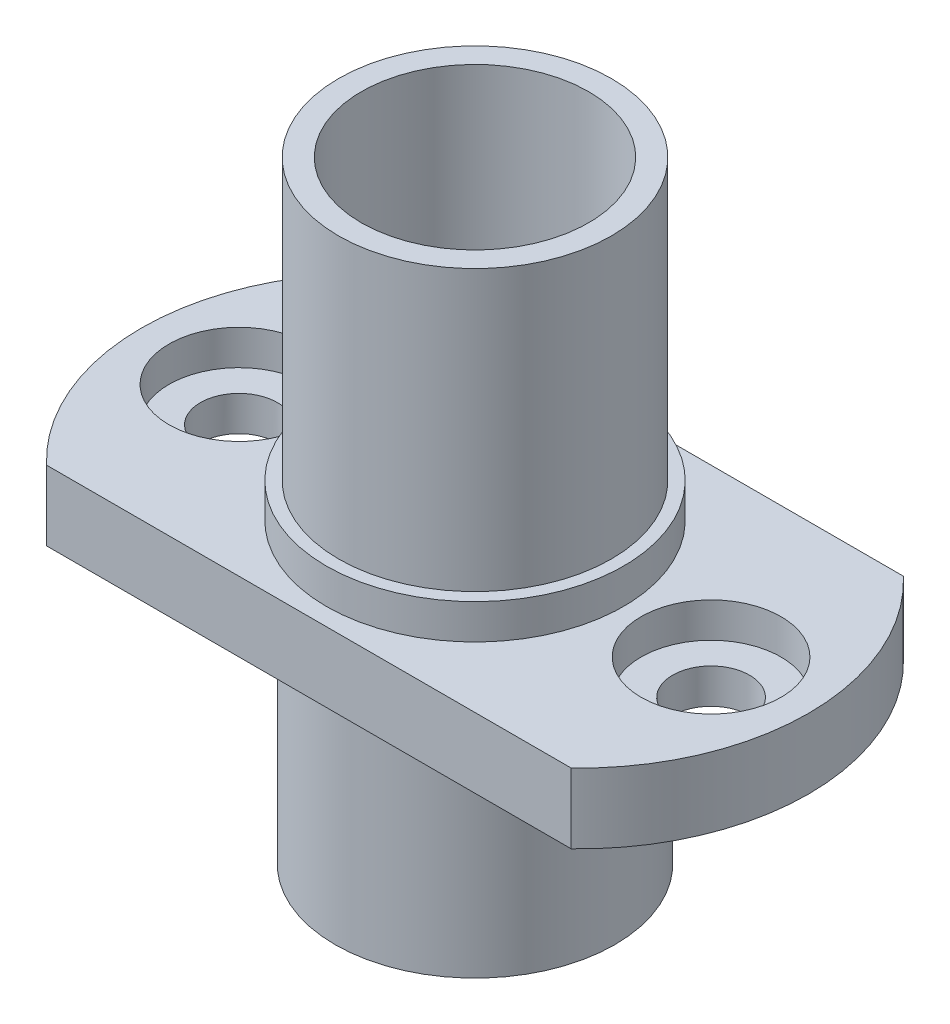
ISO-10303-21;
HEADER;
FILE_DESCRIPTION(('STEP AP214'),'2;1');
FILE_NAME('part.step','',(''),(''),'','','');
FILE_SCHEMA(('AUTOMOTIVE_DESIGN { 1 0 10303 214 1 1 1 1 }'));
ENDSEC;
DATA;
#1=APPLICATION_CONTEXT('core data for automotive mechanical design processes');
#2=APPLICATION_PROTOCOL_DEFINITION('international standard','automotive_design',2000,#1);
#3=PRODUCT_CONTEXT('',#1,'mechanical');
#4=PRODUCT('Part','Part','',(#3));
#5=PRODUCT_RELATED_PRODUCT_CATEGORY('part','',(#4));
#6=PRODUCT_DEFINITION_FORMATION('','',#4);
#7=PRODUCT_DEFINITION_CONTEXT('part definition',#1,'design');
#8=PRODUCT_DEFINITION('design','',#6,#7);
#9=PRODUCT_DEFINITION_SHAPE('','',#8);
#10=(LENGTH_UNIT() NAMED_UNIT(*) SI_UNIT(.MILLI.,.METRE.));
#11=(NAMED_UNIT(*) PLANE_ANGLE_UNIT() SI_UNIT($,.RADIAN.));
#12=(NAMED_UNIT(*) SI_UNIT($,.STERADIAN.) SOLID_ANGLE_UNIT());
#13=UNCERTAINTY_MEASURE_WITH_UNIT(LENGTH_MEASURE(1.E-05),#10,'distance_accuracy_value','');
#14=(GEOMETRIC_REPRESENTATION_CONTEXT(3) GLOBAL_UNCERTAINTY_ASSIGNED_CONTEXT((#13)) GLOBAL_UNIT_ASSIGNED_CONTEXT((#10,
#11,#12)) REPRESENTATION_CONTEXT('',''));
#15=CARTESIAN_POINT('',(0.,0.,0.));
#16=DIRECTION('',(0.,0.,1.));
#17=DIRECTION('',(1.,0.,0.));
#18=AXIS2_PLACEMENT_3D('',#15,#16,#17);
#19=CARTESIAN_POINT('',(-2.99001108648813,-1.,0.));
#20=DIRECTION('',(0.,-1.,0.));
#21=DIRECTION('',(0.,0.,-1.));
#22=AXIS2_PLACEMENT_3D('',#19,#20,#21);
#23=PLANE('',#22);
#24=CARTESIAN_POINT('',(-2.99001108648813,-1.,0.));
#25=DIRECTION('',(0.,1.,0.));
#26=DIRECTION('',(0.,0.,-1.));
#27=AXIS2_PLACEMENT_3D('',#24,#25,#26);
#28=CIRCLE('',#27,6.55);
#29=CARTESIAN_POINT('',(-7.5,-1.,-4.75));
#30=VERTEX_POINT('',#29);
#31=CARTESIAN_POINT('',(-7.5,-1.,4.75));
#32=VERTEX_POINT('',#31);
#33=EDGE_CURVE('E97',#30,#32,#28,.T.);
#34=ORIENTED_EDGE('',*,*,#33,.F.);
#35=DIRECTION('',(-1.,0.,0.));
#36=VECTOR('',#35,1.);
#37=CARTESIAN_POINT('',(-7.5,-1.,-4.75));
#38=LINE('',#37,#36);
#39=CARTESIAN_POINT('',(7.5,-1.,-4.75));
#40=VERTEX_POINT('',#39);
#41=EDGE_CURVE('E111',#40,#30,#38,.T.);
#42=ORIENTED_EDGE('',*,*,#41,.F.);
#43=CARTESIAN_POINT('',(2.99001108648813,-1.,0.));
#44=DIRECTION('',(0.,1.,0.));
#45=DIRECTION('',(0.,0.,1.));
#46=AXIS2_PLACEMENT_3D('',#43,#44,#45);
#47=CIRCLE('',#46,6.55);
#48=CARTESIAN_POINT('',(7.50000000000001,-1.,4.75));
#49=VERTEX_POINT('',#48);
#50=EDGE_CURVE('E100',#49,#40,#47,.T.);
#51=ORIENTED_EDGE('',*,*,#50,.F.);
#52=DIRECTION('',(1.,0.,0.));
#53=VECTOR('',#52,1.);
#54=CARTESIAN_POINT('',(-7.5,-1.,4.75));
#55=LINE('',#54,#53);
#56=EDGE_CURVE('E85',#32,#49,#55,.T.);
#57=ORIENTED_EDGE('',*,*,#56,.F.);
#58=EDGE_LOOP('',(#34,#42,#51,#57));
#59=FACE_BOUND('',#58,.T.);
#60=CARTESIAN_POINT('',(6.75,-1.,0.));
#61=DIRECTION('',(0.,1.,0.));
#62=DIRECTION('',(0.,0.,1.));
#63=AXIS2_PLACEMENT_3D('',#60,#61,#62);
#64=CIRCLE('',#63,1.1);
#65=CARTESIAN_POINT('',(6.75,-1.,1.1));
#66=VERTEX_POINT('',#65);
#67=EDGE_CURVE('E150',#66,#66,#64,.T.);
#68=ORIENTED_EDGE('',*,*,#67,.T.);
#69=EDGE_LOOP('',(#68));
#70=FACE_BOUND('',#69,.T.);
#71=CARTESIAN_POINT('',(-6.75,-1.,0.));
#72=DIRECTION('',(0.,1.,0.));
#73=DIRECTION('',(0.,0.,-1.));
#74=AXIS2_PLACEMENT_3D('',#71,#72,#73);
#75=CIRCLE('',#74,1.1);
#76=CARTESIAN_POINT('',(-6.75,-1.,-1.1));
#77=VERTEX_POINT('',#76);
#78=EDGE_CURVE('E124',#77,#77,#75,.T.);
#79=ORIENTED_EDGE('',*,*,#78,.T.);
#80=EDGE_LOOP('',(#79));
#81=FACE_BOUND('',#80,.T.);
#82=CARTESIAN_POINT('',(0.,-1.,0.));
#83=DIRECTION('',(0.,-1.,0.));
#84=DIRECTION('',(0.,0.,-1.));
#85=AXIS2_PLACEMENT_3D('',#82,#83,#84);
#86=CIRCLE('',#85,4.);
#87=CARTESIAN_POINT('',(0.,-1.,4.));
#88=VERTEX_POINT('',#87);
#89=EDGE_CURVE('E143',#88,#88,#86,.T.);
#90=ORIENTED_EDGE('',*,*,#89,.F.);
#91=EDGE_LOOP('',(#90));
#92=FACE_BOUND('',#91,.T.);
#93=ADVANCED_FACE('F39',(#59,#70,#81,#92),#23,.T.);
#94=CARTESIAN_POINT('',(-6.75,-1.,0.));
#95=DIRECTION('',(0.,1.,0.));
#96=DIRECTION('',(0.,0.,1.));
#97=AXIS2_PLACEMENT_3D('',#94,#95,#96);
#98=CYLINDRICAL_SURFACE('',#97,1.1);
#99=ORIENTED_EDGE('',*,*,#78,.F.);
#100=EDGE_LOOP('',(#99));
#101=FACE_BOUND('',#100,.T.);
#102=CARTESIAN_POINT('',(-6.75,0.,0.));
#103=DIRECTION('',(0.,1.,0.));
#104=DIRECTION('',(0.,0.,1.));
#105=AXIS2_PLACEMENT_3D('',#102,#103,#104);
#106=CIRCLE('',#105,1.1);
#107=CARTESIAN_POINT('',(-6.75,0.,1.1));
#108=VERTEX_POINT('',#107);
#109=EDGE_CURVE('E126',#108,#108,#106,.F.);
#110=ORIENTED_EDGE('',*,*,#109,.F.);
#111=EDGE_LOOP('',(#110));
#112=FACE_BOUND('',#111,.T.);
#113=ADVANCED_FACE('F174',(#101,#112),#98,.F.);
#114=CARTESIAN_POINT('',(6.75,-1.,0.));
#115=DIRECTION('',(0.,1.,0.));
#116=DIRECTION('',(0.,0.,1.));
#117=AXIS2_PLACEMENT_3D('',#114,#115,#116);
#118=CYLINDRICAL_SURFACE('',#117,1.1);
#119=ORIENTED_EDGE('',*,*,#67,.F.);
#120=EDGE_LOOP('',(#119));
#121=FACE_BOUND('',#120,.T.);
#122=CARTESIAN_POINT('',(6.75,0.,0.));
#123=DIRECTION('',(0.,1.,0.));
#124=DIRECTION('',(0.,0.,1.));
#125=AXIS2_PLACEMENT_3D('',#122,#123,#124);
#126=CIRCLE('',#125,1.1);
#127=CARTESIAN_POINT('',(6.75,0.,1.1));
#128=VERTEX_POINT('',#127);
#129=EDGE_CURVE('E122',#128,#128,#126,.F.);
#130=ORIENTED_EDGE('',*,*,#129,.F.);
#131=EDGE_LOOP('',(#130));
#132=FACE_BOUND('',#131,.T.);
#133=ADVANCED_FACE('F179',(#121,#132),#118,.F.);
#134=CARTESIAN_POINT('',(-2.99001108648813,1.,0.));
#135=DIRECTION('',(0.,-1.,0.));
#136=DIRECTION('',(0.,0.,-1.));
#137=AXIS2_PLACEMENT_3D('',#134,#135,#136);
#138=PLANE('',#137);
#139=CARTESIAN_POINT('',(-6.75,1.,0.));
#140=DIRECTION('',(0.,1.,0.));
#141=DIRECTION('',(0.,0.,1.));
#142=AXIS2_PLACEMENT_3D('',#139,#140,#141);
#143=CIRCLE('',#142,2.);
#144=CARTESIAN_POINT('',(-6.75,1.,2.));
#145=VERTEX_POINT('',#144);
#146=EDGE_CURVE('E135',#145,#145,#143,.T.);
#147=ORIENTED_EDGE('',*,*,#146,.F.);
#148=EDGE_LOOP('',(#147));
#149=FACE_BOUND('',#148,.T.);
#150=CARTESIAN_POINT('',(6.75,1.,0.));
#151=DIRECTION('',(0.,1.,0.));
#152=DIRECTION('',(0.,0.,1.));
#153=AXIS2_PLACEMENT_3D('',#150,#151,#152);
#154=CIRCLE('',#153,2.);
#155=CARTESIAN_POINT('',(6.75,1.,2.));
#156=VERTEX_POINT('',#155);
#157=EDGE_CURVE('E128',#156,#156,#154,.T.);
#158=ORIENTED_EDGE('',*,*,#157,.F.);
#159=EDGE_LOOP('',(#158));
#160=FACE_BOUND('',#159,.T.);
#161=CARTESIAN_POINT('',(-2.99001108648813,1.,0.));
#162=DIRECTION('',(0.,1.,0.));
#163=DIRECTION('',(0.,0.,-1.));
#164=AXIS2_PLACEMENT_3D('',#161,#162,#163);
#165=CIRCLE('',#164,6.55);
#166=CARTESIAN_POINT('',(-7.5,1.,-4.75));
#167=VERTEX_POINT('',#166);
#168=CARTESIAN_POINT('',(-7.5,1.,4.75));
#169=VERTEX_POINT('',#168);
#170=EDGE_CURVE('E113',#167,#169,#165,.T.);
#171=ORIENTED_EDGE('',*,*,#170,.T.);
#172=DIRECTION('',(1.,0.,0.));
#173=VECTOR('',#172,1.);
#174=CARTESIAN_POINT('',(-7.5,1.,4.75));
#175=LINE('',#174,#173);
#176=CARTESIAN_POINT('',(7.50000000000001,1.,4.75));
#177=VERTEX_POINT('',#176);
#178=EDGE_CURVE('E86',#169,#177,#175,.T.);
#179=ORIENTED_EDGE('',*,*,#178,.T.);
#180=CARTESIAN_POINT('',(2.99001108648813,1.,0.));
#181=DIRECTION('',(0.,1.,0.));
#182=DIRECTION('',(0.,0.,1.));
#183=AXIS2_PLACEMENT_3D('',#180,#181,#182);
#184=CIRCLE('',#183,6.55);
#185=CARTESIAN_POINT('',(7.5,1.,-4.75));
#186=VERTEX_POINT('',#185);
#187=EDGE_CURVE('E61',#177,#186,#184,.T.);
#188=ORIENTED_EDGE('',*,*,#187,.T.);
#189=DIRECTION('',(-1.,0.,0.));
#190=VECTOR('',#189,1.);
#191=CARTESIAN_POINT('',(-7.5,1.,-4.75));
#192=LINE('',#191,#190);
#193=EDGE_CURVE('E56',#186,#167,#192,.T.);
#194=ORIENTED_EDGE('',*,*,#193,.T.);
#195=EDGE_LOOP('',(#171,#179,#188,#194));
#196=FACE_BOUND('',#195,.T.);
#197=CARTESIAN_POINT('',(0.,1.,0.));
#198=DIRECTION('',(0.,-1.,0.));
#199=DIRECTION('',(0.,0.,-1.));
#200=AXIS2_PLACEMENT_3D('',#197,#198,#199);
#201=CIRCLE('',#200,4.25);
#202=CARTESIAN_POINT('',(0.,1.,-4.25));
#203=VERTEX_POINT('',#202);
#204=EDGE_CURVE('E13',#203,#203,#201,.F.);
#205=ORIENTED_EDGE('',*,*,#204,.F.);
#206=EDGE_LOOP('',(#205));
#207=FACE_BOUND('',#206,.T.);
#208=ADVANCED_FACE('F171',(#149,#160,#196,#207),#138,.F.);
#209=CARTESIAN_POINT('',(-2.99001108648813,1.,0.));
#210=DIRECTION('',(0.,-1.,0.));
#211=DIRECTION('',(0.,0.,-1.));
#212=AXIS2_PLACEMENT_3D('',#209,#210,#211);
#213=CYLINDRICAL_SURFACE('',#212,6.55);
#214=DIRECTION('',(0.,-1.,0.));
#215=VECTOR('',#214,1.);
#216=CARTESIAN_POINT('',(-7.5,1.,-4.75));
#217=LINE('',#216,#215);
#218=EDGE_CURVE('E102',#167,#30,#217,.T.);
#219=ORIENTED_EDGE('',*,*,#218,.T.);
#220=ORIENTED_EDGE('',*,*,#33,.T.);
#221=DIRECTION('',(0.,-1.,0.));
#222=VECTOR('',#221,1.);
#223=CARTESIAN_POINT('',(-7.5,1.,4.75));
#224=LINE('',#223,#222);
#225=EDGE_CURVE('E48',#169,#32,#224,.T.);
#226=ORIENTED_EDGE('',*,*,#225,.F.);
#227=ORIENTED_EDGE('',*,*,#170,.F.);
#228=EDGE_LOOP('',(#219,#220,#226,#227));
#229=FACE_BOUND('',#228,.T.);
#230=ADVANCED_FACE('F41',(#229),#213,.T.);
#231=CARTESIAN_POINT('',(-7.5,1.,4.75));
#232=DIRECTION('',(0.,0.,-1.));
#233=DIRECTION('',(-1.,0.,0.));
#234=AXIS2_PLACEMENT_3D('',#231,#232,#233);
#235=PLANE('',#234);
#236=ORIENTED_EDGE('',*,*,#225,.T.);
#237=ORIENTED_EDGE('',*,*,#56,.T.);
#238=DIRECTION('',(0.,-1.,0.));
#239=VECTOR('',#238,1.);
#240=CARTESIAN_POINT('',(7.50000000000001,1.,4.75));
#241=LINE('',#240,#239);
#242=EDGE_CURVE('E90',#177,#49,#241,.T.);
#243=ORIENTED_EDGE('',*,*,#242,.F.);
#244=ORIENTED_EDGE('',*,*,#178,.F.);
#245=EDGE_LOOP('',(#236,#237,#243,#244));
#246=FACE_BOUND('',#245,.T.);
#247=ADVANCED_FACE('F83',(#246),#235,.F.);
#248=CARTESIAN_POINT('',(2.99001108648813,1.,0.));
#249=DIRECTION('',(0.,-1.,0.));
#250=DIRECTION('',(0.,0.,-1.));
#251=AXIS2_PLACEMENT_3D('',#248,#249,#250);
#252=CYLINDRICAL_SURFACE('',#251,6.55);
#253=ORIENTED_EDGE('',*,*,#242,.T.);
#254=ORIENTED_EDGE('',*,*,#50,.T.);
#255=DIRECTION('',(0.,-1.,0.));
#256=VECTOR('',#255,1.);
#257=CARTESIAN_POINT('',(7.5,1.,-4.75));
#258=LINE('',#257,#256);
#259=EDGE_CURVE('E119',#186,#40,#258,.T.);
#260=ORIENTED_EDGE('',*,*,#259,.F.);
#261=ORIENTED_EDGE('',*,*,#187,.F.);
#262=EDGE_LOOP('',(#253,#254,#260,#261));
#263=FACE_BOUND('',#262,.T.);
#264=ADVANCED_FACE('F188',(#263),#252,.T.);
#265=CARTESIAN_POINT('',(-7.5,1.,-4.75));
#266=DIRECTION('',(0.,0.,1.));
#267=DIRECTION('',(1.,0.,0.));
#268=AXIS2_PLACEMENT_3D('',#265,#266,#267);
#269=PLANE('',#268);
#270=ORIENTED_EDGE('',*,*,#259,.T.);
#271=ORIENTED_EDGE('',*,*,#41,.T.);
#272=ORIENTED_EDGE('',*,*,#218,.F.);
#273=ORIENTED_EDGE('',*,*,#193,.F.);
#274=EDGE_LOOP('',(#270,#271,#272,#273));
#275=FACE_BOUND('',#274,.T.);
#276=ADVANCED_FACE('F185',(#275),#269,.F.);
#277=CARTESIAN_POINT('',(0.,10.,0.));
#278=DIRECTION('',(0.,-1.,0.));
#279=DIRECTION('',(0.,0.,-1.));
#280=AXIS2_PLACEMENT_3D('',#277,#278,#279);
#281=CYLINDRICAL_SURFACE('',#280,4.25);
#282=CARTESIAN_POINT('',(0.,2.,0.));
#283=DIRECTION('',(0.,-1.,0.));
#284=DIRECTION('',(0.,0.,-1.));
#285=AXIS2_PLACEMENT_3D('',#282,#283,#284);
#286=CIRCLE('',#285,4.25);
#287=CARTESIAN_POINT('',(0.,2.,-4.25));
#288=VERTEX_POINT('',#287);
#289=EDGE_CURVE('E43',#288,#288,#286,.T.);
#290=ORIENTED_EDGE('',*,*,#289,.T.);
#291=EDGE_LOOP('',(#290));
#292=FACE_BOUND('',#291,.T.);
#293=ORIENTED_EDGE('',*,*,#204,.T.);
#294=EDGE_LOOP('',(#293));
#295=FACE_BOUND('',#294,.T.);
#296=ADVANCED_FACE('F183',(#292,#295),#281,.T.);
#297=CARTESIAN_POINT('',(6.75,0.,0.));
#298=DIRECTION('',(0.,1.,0.));
#299=DIRECTION('',(0.,0.,1.));
#300=AXIS2_PLACEMENT_3D('',#297,#298,#299);
#301=PLANE('',#300);
#302=CARTESIAN_POINT('',(6.75,0.,0.));
#303=DIRECTION('',(0.,1.,0.));
#304=DIRECTION('',(0.,0.,1.));
#305=AXIS2_PLACEMENT_3D('',#302,#303,#304);
#306=CIRCLE('',#305,2.);
#307=CARTESIAN_POINT('',(6.75,0.,2.));
#308=VERTEX_POINT('',#307);
#309=EDGE_CURVE('E125',#308,#308,#306,.T.);
#310=ORIENTED_EDGE('',*,*,#309,.T.);
#311=EDGE_LOOP('',(#310));
#312=FACE_BOUND('',#311,.T.);
#313=ORIENTED_EDGE('',*,*,#129,.T.);
#314=EDGE_LOOP('',(#313));
#315=FACE_BOUND('',#314,.T.);
#316=ADVANCED_FACE('F211',(#312,#315),#301,.T.);
#317=CARTESIAN_POINT('',(6.75,0.,0.));
#318=DIRECTION('',(0.,1.,0.));
#319=DIRECTION('',(0.,0.,1.));
#320=AXIS2_PLACEMENT_3D('',#317,#318,#319);
#321=CYLINDRICAL_SURFACE('',#320,2.);
#322=ORIENTED_EDGE('',*,*,#309,.F.);
#323=EDGE_LOOP('',(#322));
#324=FACE_BOUND('',#323,.T.);
#325=ORIENTED_EDGE('',*,*,#157,.T.);
#326=EDGE_LOOP('',(#325));
#327=FACE_BOUND('',#326,.T.);
#328=ADVANCED_FACE('F216',(#324,#327),#321,.F.);
#329=CARTESIAN_POINT('',(-6.75,0.,0.));
#330=DIRECTION('',(0.,1.,0.));
#331=DIRECTION('',(0.,0.,1.));
#332=AXIS2_PLACEMENT_3D('',#329,#330,#331);
#333=PLANE('',#332);
#334=CARTESIAN_POINT('',(-6.75,0.,0.));
#335=DIRECTION('',(0.,1.,0.));
#336=DIRECTION('',(0.,0.,1.));
#337=AXIS2_PLACEMENT_3D('',#334,#335,#336);
#338=CIRCLE('',#337,2.);
#339=CARTESIAN_POINT('',(-6.75,0.,2.));
#340=VERTEX_POINT('',#339);
#341=EDGE_CURVE('E129',#340,#340,#338,.T.);
#342=ORIENTED_EDGE('',*,*,#341,.T.);
#343=EDGE_LOOP('',(#342));
#344=FACE_BOUND('',#343,.T.);
#345=ORIENTED_EDGE('',*,*,#109,.T.);
#346=EDGE_LOOP('',(#345));
#347=FACE_BOUND('',#346,.T.);
#348=ADVANCED_FACE('F249',(#344,#347),#333,.T.);
#349=CARTESIAN_POINT('',(-6.75,0.,0.));
#350=DIRECTION('',(0.,1.,0.));
#351=DIRECTION('',(0.,0.,1.));
#352=AXIS2_PLACEMENT_3D('',#349,#350,#351);
#353=CYLINDRICAL_SURFACE('',#352,2.);
#354=ORIENTED_EDGE('',*,*,#341,.F.);
#355=EDGE_LOOP('',(#354));
#356=FACE_BOUND('',#355,.T.);
#357=ORIENTED_EDGE('',*,*,#146,.T.);
#358=EDGE_LOOP('',(#357));
#359=FACE_BOUND('',#358,.T.);
#360=ADVANCED_FACE('F239',(#356,#359),#353,.F.);
#361=CARTESIAN_POINT('',(0.,-7.5,0.));
#362=DIRECTION('',(0.,1.,0.));
#363=DIRECTION('',(0.,0.,1.));
#364=AXIS2_PLACEMENT_3D('',#361,#362,#363);
#365=CYLINDRICAL_SURFACE('',#364,4.);
#366=CARTESIAN_POINT('',(0.,-7.5,0.));
#367=DIRECTION('',(0.,-1.,0.));
#368=DIRECTION('',(0.,0.,-1.));
#369=AXIS2_PLACEMENT_3D('',#366,#367,#368);
#370=CIRCLE('',#369,4.);
#371=CARTESIAN_POINT('',(0.,-7.5,4.));
#372=VERTEX_POINT('',#371);
#373=EDGE_CURVE('E140',#372,#372,#370,.T.);
#374=CARTESIAN_POINT('',(0.,-7.5,4.));
#375=CARTESIAN_POINT('',(0.,-7.43229166666667,4.));
#376=CARTESIAN_POINT('',(0.,-7.36458333333333,4.));
#377=CARTESIAN_POINT('',(0.,-7.22916666666667,4.));
#378=CARTESIAN_POINT('',(0.,-7.16145833333333,4.));
#379=CARTESIAN_POINT('',(0.,-7.02604166666667,4.));
#380=CARTESIAN_POINT('',(0.,-6.95833333333333,4.));
#381=CARTESIAN_POINT('',(0.,-6.82291666666667,4.));
#382=CARTESIAN_POINT('',(0.,-6.75520833333333,4.));
#383=CARTESIAN_POINT('',(0.,-6.61979166666667,4.));
#384=CARTESIAN_POINT('',(0.,-6.55208333333333,4.));
#385=CARTESIAN_POINT('',(0.,-6.41666666666667,4.));
#386=CARTESIAN_POINT('',(0.,-6.34895833333333,4.));
#387=CARTESIAN_POINT('',(0.,-6.21354166666667,4.));
#388=CARTESIAN_POINT('',(0.,-6.14583333333333,4.));
#389=CARTESIAN_POINT('',(0.,-6.01041666666667,4.));
#390=CARTESIAN_POINT('',(0.,-5.94270833333333,4.));
#391=CARTESIAN_POINT('',(0.,-5.80729166666667,4.));
#392=CARTESIAN_POINT('',(0.,-5.73958333333333,4.));
#393=CARTESIAN_POINT('',(0.,-5.60416666666667,4.));
#394=CARTESIAN_POINT('',(0.,-5.53645833333333,4.));
#395=CARTESIAN_POINT('',(0.,-5.40104166666667,4.));
#396=CARTESIAN_POINT('',(0.,-5.33333333333333,4.));
#397=CARTESIAN_POINT('',(0.,-5.19791666666667,4.));
#398=CARTESIAN_POINT('',(0.,-5.13020833333333,4.));
#399=CARTESIAN_POINT('',(0.,-4.99479166666667,4.));
#400=CARTESIAN_POINT('',(0.,-4.92708333333333,4.));
#401=CARTESIAN_POINT('',(0.,-4.79166666666667,4.));
#402=CARTESIAN_POINT('',(0.,-4.72395833333333,4.));
#403=CARTESIAN_POINT('',(0.,-4.58854166666667,4.));
#404=CARTESIAN_POINT('',(0.,-4.52083333333333,4.));
#405=CARTESIAN_POINT('',(0.,-4.38541666666667,4.));
#406=CARTESIAN_POINT('',(0.,-4.31770833333333,4.));
#407=CARTESIAN_POINT('',(0.,-4.18229166666667,4.));
#408=CARTESIAN_POINT('',(0.,-4.11458333333333,4.));
#409=CARTESIAN_POINT('',(0.,-3.97916666666667,4.));
#410=CARTESIAN_POINT('',(0.,-3.91145833333333,4.));
#411=CARTESIAN_POINT('',(0.,-3.77604166666667,4.));
#412=CARTESIAN_POINT('',(0.,-3.70833333333333,4.));
#413=CARTESIAN_POINT('',(0.,-3.57291666666667,4.));
#414=CARTESIAN_POINT('',(0.,-3.50520833333333,4.));
#415=CARTESIAN_POINT('',(0.,-3.36979166666667,4.));
#416=CARTESIAN_POINT('',(0.,-3.30208333333333,4.));
#417=CARTESIAN_POINT('',(0.,-3.16666666666667,4.));
#418=CARTESIAN_POINT('',(0.,-3.09895833333333,4.));
#419=CARTESIAN_POINT('',(0.,-2.96354166666667,4.));
#420=CARTESIAN_POINT('',(0.,-2.89583333333333,4.));
#421=CARTESIAN_POINT('',(0.,-2.76041666666667,4.));
#422=CARTESIAN_POINT('',(0.,-2.69270833333333,4.));
#423=CARTESIAN_POINT('',(0.,-2.55729166666667,4.));
#424=CARTESIAN_POINT('',(0.,-2.48958333333333,4.));
#425=CARTESIAN_POINT('',(0.,-2.35416666666667,4.));
#426=CARTESIAN_POINT('',(0.,-2.28645833333333,4.));
#427=CARTESIAN_POINT('',(0.,-2.15104166666667,4.));
#428=CARTESIAN_POINT('',(0.,-2.08333333333333,4.));
#429=CARTESIAN_POINT('',(0.,-1.94791666666667,4.));
#430=CARTESIAN_POINT('',(0.,-1.88020833333333,4.));
#431=CARTESIAN_POINT('',(0.,-1.74479166666667,4.));
#432=CARTESIAN_POINT('',(0.,-1.67708333333333,4.));
#433=CARTESIAN_POINT('',(0.,-1.54166666666667,4.));
#434=CARTESIAN_POINT('',(0.,-1.47395833333333,4.));
#435=CARTESIAN_POINT('',(0.,-1.33854166666667,4.));
#436=CARTESIAN_POINT('',(0.,-1.27083333333333,4.));
#437=CARTESIAN_POINT('',(0.,-1.13541666666667,4.));
#438=CARTESIAN_POINT('',(0.,-1.06770833333333,4.));
#439=CARTESIAN_POINT('',(0.,-1.,4.));
#440=B_SPLINE_CURVE_WITH_KNOTS('',3,(#374,#375,#376,#377,#378,#379,#380,#381,#382,#383,#384,
#385,#386,#387,#388,#389,#390,#391,#392,#393,#394,#395,#396,#397,#398,#399,#400,#401,#402,#403,
#404,#405,#406,#407,#408,#409,#410,#411,#412,#413,#414,#415,#416,#417,#418,#419,#420,#421,#422,
#423,#424,#425,#426,#427,#428,#429,#430,#431,#432,#433,#434,#435,#436,#437,#438,#439),
.UNSPECIFIED.,.F.,.F.,(4,2,2,2,2,2,2,2,2,2,2,2,2,2,2,2,2,2,2,2,2,2,2,2,2,2,2,2,2,2,2,2,4),(0.,
0.203125,0.40625,0.609375000000001,0.812500000000001,1.015625,1.21875,1.421875,1.625,1.828125,
2.03125,2.234375,2.4375,2.640625,2.84375,3.046875,3.25,3.453125,3.65625,3.859375,4.0625,
4.265625,4.46875,4.671875,4.875,5.078125,5.28125,5.484375,5.6875,5.890625,6.09375,6.296875,6.5),.UNSPECIFIED.);
#441=EDGE_CURVE('BSEAM236',#372,#88,#440,.T.);
#442=ORIENTED_EDGE('',*,*,#373,.F.);
#443=ORIENTED_EDGE('',*,*,#89,.T.);
#444=ORIENTED_EDGE('',*,*,#441,.T.);
#445=ORIENTED_EDGE('',*,*,#441,.F.);
#446=EDGE_LOOP('',(#442,#444,#443,#445));
#447=FACE_BOUND('',#446,.T.);
#448=ADVANCED_FACE('F236',(#447),#365,.T.);
#449=CARTESIAN_POINT('',(0.,-7.5,0.));
#450=DIRECTION('',(0.,-1.,0.));
#451=DIRECTION('',(0.,0.,-1.));
#452=AXIS2_PLACEMENT_3D('',#449,#450,#451);
#453=PLANE('',#452);
#454=ORIENTED_EDGE('',*,*,#373,.T.);
#455=EDGE_LOOP('',(#454));
#456=FACE_BOUND('',#455,.T.);
#457=ADVANCED_FACE('F234',(#456),#453,.T.);
#458=CARTESIAN_POINT('',(-2.99001108648813,2.,0.));
#459=DIRECTION('',(0.,-1.,0.));
#460=DIRECTION('',(0.,0.,-1.));
#461=AXIS2_PLACEMENT_3D('',#458,#459,#460);
#462=PLANE('',#461);
#463=CARTESIAN_POINT('',(0.,2.,0.));
#464=DIRECTION('',(0.,-1.,0.));
#465=DIRECTION('',(0.,0.,-1.));
#466=AXIS2_PLACEMENT_3D('',#463,#464,#465);
#467=CIRCLE('',#466,3.9);
#468=CARTESIAN_POINT('',(0.,2.,3.9));
#469=VERTEX_POINT('',#468);
#470=EDGE_CURVE('E222',#469,#469,#467,.F.);
#471=ORIENTED_EDGE('',*,*,#470,.F.);
#472=EDGE_LOOP('',(#471));
#473=FACE_BOUND('',#472,.T.);
#474=ORIENTED_EDGE('',*,*,#289,.F.);
#475=EDGE_LOOP('',(#474));
#476=FACE_BOUND('',#475,.T.);
#477=ADVANCED_FACE('F247',(#473,#476),#462,.F.);
#478=CARTESIAN_POINT('',(0.,-20.5296213568261,0.));
#479=DIRECTION('',(0.,1.,0.));
#480=DIRECTION('',(0.,0.,1.));
#481=AXIS2_PLACEMENT_3D('',#478,#479,#480);
#482=CYLINDRICAL_SURFACE('',#481,3.9);
#483=CARTESIAN_POINT('',(0.,10.,0.));
#484=DIRECTION('',(0.,1.,0.));
#485=DIRECTION('',(0.,0.,1.));
#486=AXIS2_PLACEMENT_3D('',#483,#484,#485);
#487=CIRCLE('',#486,3.9);
#488=CARTESIAN_POINT('',(0.,9.99999999999999,3.9));
#489=VERTEX_POINT('',#488);
#490=EDGE_CURVE('E225',#489,#489,#487,.T.);
#491=CARTESIAN_POINT('',(0.,9.99999999999999,3.9));
#492=CARTESIAN_POINT('',(0.,9.91666666666666,3.9));
#493=CARTESIAN_POINT('',(0.,9.83333333333333,3.9));
#494=CARTESIAN_POINT('',(0.,9.66666666666666,3.9));
#495=CARTESIAN_POINT('',(0.,9.58333333333333,3.9));
#496=CARTESIAN_POINT('',(0.,9.41666666666666,3.9));
#497=CARTESIAN_POINT('',(0.,9.33333333333333,3.9));
#498=CARTESIAN_POINT('',(0.,9.16666666666666,3.9));
#499=CARTESIAN_POINT('',(0.,9.08333333333333,3.9));
#500=CARTESIAN_POINT('',(0.,8.91666666666666,3.9));
#501=CARTESIAN_POINT('',(0.,8.83333333333333,3.9));
#502=CARTESIAN_POINT('',(0.,8.66666666666666,3.9));
#503=CARTESIAN_POINT('',(0.,8.58333333333333,3.9));
#504=CARTESIAN_POINT('',(0.,8.41666666666666,3.9));
#505=CARTESIAN_POINT('',(0.,8.33333333333333,3.9));
#506=CARTESIAN_POINT('',(0.,8.16666666666666,3.9));
#507=CARTESIAN_POINT('',(0.,8.08333333333333,3.9));
#508=CARTESIAN_POINT('',(0.,7.91666666666666,3.9));
#509=CARTESIAN_POINT('',(0.,7.83333333333333,3.9));
#510=CARTESIAN_POINT('',(0.,7.66666666666666,3.9));
#511=CARTESIAN_POINT('',(0.,7.58333333333333,3.9));
#512=CARTESIAN_POINT('',(0.,7.41666666666666,3.9));
#513=CARTESIAN_POINT('',(0.,7.33333333333333,3.9));
#514=CARTESIAN_POINT('',(0.,7.16666666666666,3.9));
#515=CARTESIAN_POINT('',(0.,7.08333333333333,3.9));
#516=CARTESIAN_POINT('',(0.,6.91666666666667,3.9));
#517=CARTESIAN_POINT('',(0.,6.83333333333333,3.9));
#518=CARTESIAN_POINT('',(0.,6.66666666666667,3.9));
#519=CARTESIAN_POINT('',(0.,6.58333333333333,3.9));
#520=CARTESIAN_POINT('',(0.,6.41666666666667,3.9));
#521=CARTESIAN_POINT('',(0.,6.33333333333333,3.9));
#522=CARTESIAN_POINT('',(0.,6.16666666666667,3.9));
#523=CARTESIAN_POINT('',(0.,6.08333333333333,3.9));
#524=CARTESIAN_POINT('',(0.,5.91666666666666,3.9));
#525=CARTESIAN_POINT('',(0.,5.83333333333333,3.9));
#526=CARTESIAN_POINT('',(0.,5.66666666666666,3.9));
#527=CARTESIAN_POINT('',(0.,5.58333333333333,3.9));
#528=CARTESIAN_POINT('',(0.,5.41666666666666,3.9));
#529=CARTESIAN_POINT('',(0.,5.33333333333333,3.9));
#530=CARTESIAN_POINT('',(0.,5.16666666666666,3.9));
#531=CARTESIAN_POINT('',(0.,5.08333333333333,3.9));
#532=CARTESIAN_POINT('',(0.,4.91666666666666,3.9));
#533=CARTESIAN_POINT('',(0.,4.83333333333333,3.9));
#534=CARTESIAN_POINT('',(0.,4.66666666666667,3.9));
#535=CARTESIAN_POINT('',(0.,4.58333333333333,3.9));
#536=CARTESIAN_POINT('',(0.,4.41666666666667,3.9));
#537=CARTESIAN_POINT('',(0.,4.33333333333333,3.9));
#538=CARTESIAN_POINT('',(0.,4.16666666666667,3.9));
#539=CARTESIAN_POINT('',(0.,4.08333333333333,3.9));
#540=CARTESIAN_POINT('',(0.,3.91666666666667,3.9));
#541=CARTESIAN_POINT('',(0.,3.83333333333333,3.9));
#542=CARTESIAN_POINT('',(0.,3.66666666666667,3.9));
#543=CARTESIAN_POINT('',(0.,3.58333333333333,3.9));
#544=CARTESIAN_POINT('',(0.,3.41666666666667,3.9));
#545=CARTESIAN_POINT('',(0.,3.33333333333334,3.9));
#546=CARTESIAN_POINT('',(0.,3.16666666666667,3.9));
#547=CARTESIAN_POINT('',(0.,3.08333333333334,3.9));
#548=CARTESIAN_POINT('',(0.,2.91666666666667,3.9));
#549=CARTESIAN_POINT('',(0.,2.83333333333334,3.9));
#550=CARTESIAN_POINT('',(0.,2.66666666666667,3.9));
#551=CARTESIAN_POINT('',(0.,2.58333333333334,3.9));
#552=CARTESIAN_POINT('',(0.,2.41666666666667,3.9));
#553=CARTESIAN_POINT('',(0.,2.33333333333334,3.9));
#554=CARTESIAN_POINT('',(0.,2.16666666666667,3.9));
#555=CARTESIAN_POINT('',(0.,2.08333333333334,3.9));
#556=CARTESIAN_POINT('',(0.,2.,3.9));
#557=B_SPLINE_CURVE_WITH_KNOTS('',3,(#491,#492,#493,#494,#495,#496,#497,#498,#499,#500,#501,
#502,#503,#504,#505,#506,#507,#508,#509,#510,#511,#512,#513,#514,#515,#516,#517,#518,#519,#520,
#521,#522,#523,#524,#525,#526,#527,#528,#529,#530,#531,#532,#533,#534,#535,#536,#537,#538,#539,
#540,#541,#542,#543,#544,#545,#546,#547,#548,#549,#550,#551,#552,#553,#554,#555,#556),
.UNSPECIFIED.,.F.,.F.,(4,2,2,2,2,2,2,2,2,2,2,2,2,2,2,2,2,2,2,2,2,2,2,2,2,2,2,2,2,2,2,2,4),(0.,
0.25,0.5,0.750000000000001,1.,1.25,1.5,1.75,2.,2.25,2.5,2.75,3.,3.25,3.5,3.75,4.,4.25,4.5,4.75,
5.,5.25,5.49999999999999,5.74999999999999,5.99999999999999,6.25,6.5,6.74999999999999,
6.99999999999999,7.24999999999999,7.49999999999999,7.74999999999999,7.99999999999999),.UNSPECIFIED.);
#558=EDGE_CURVE('BSEAM169',#489,#469,#557,.T.);
#559=ORIENTED_EDGE('',*,*,#490,.F.);
#560=ORIENTED_EDGE('',*,*,#470,.T.);
#561=ORIENTED_EDGE('',*,*,#558,.T.);
#562=ORIENTED_EDGE('',*,*,#558,.F.);
#563=EDGE_LOOP('',(#559,#561,#560,#562));
#564=FACE_BOUND('',#563,.T.);
#565=ADVANCED_FACE('F169',(#564),#482,.T.);
#566=CARTESIAN_POINT('',(0.,1.,0.));
#567=DIRECTION('',(0.,1.,0.));
#568=DIRECTION('',(0.,0.,1.));
#569=AXIS2_PLACEMENT_3D('',#566,#567,#568);
#570=CIRCLE('',#569,3.25);
#571=CARTESIAN_POINT('',(0.,1.,3.25));
#572=VERTEX_POINT('',#571);
#573=EDGE_CURVE('E106',#572,#572,#570,.T.);
#574=ORIENTED_EDGE('',*,*,#573,.T.);
#575=EDGE_LOOP('',(#574));
#576=FACE_BOUND('',#575,.T.);
#577=ADVANCED_FACE('F156',(#576),#138,.F.);
#578=CARTESIAN_POINT('',(0.,10.,0.));
#579=DIRECTION('',(0.,-1.,0.));
#580=DIRECTION('',(0.,0.,-1.));
#581=AXIS2_PLACEMENT_3D('',#578,#579,#580);
#582=CYLINDRICAL_SURFACE('',#581,3.25);
#583=CARTESIAN_POINT('',(0.,10.,0.));
#584=DIRECTION('',(0.,1.,0.));
#585=DIRECTION('',(0.,0.,1.));
#586=AXIS2_PLACEMENT_3D('',#583,#584,#585);
#587=CIRCLE('',#586,3.25);
#588=CARTESIAN_POINT('',(0.,10.,3.25));
#589=VERTEX_POINT('',#588);
#590=EDGE_CURVE('E103',#589,#589,#587,.T.);
#591=ORIENTED_EDGE('',*,*,#590,.T.);
#592=EDGE_LOOP('',(#591));
#593=FACE_BOUND('',#592,.T.);
#594=ORIENTED_EDGE('',*,*,#573,.F.);
#595=EDGE_LOOP('',(#594));
#596=FACE_BOUND('',#595,.T.);
#597=ADVANCED_FACE('F158',(#593,#596),#582,.F.);
#598=CARTESIAN_POINT('',(0.,10.,0.));
#599=DIRECTION('',(0.,1.,0.));
#600=DIRECTION('',(0.,0.,1.));
#601=AXIS2_PLACEMENT_3D('',#598,#599,#600);
#602=PLANE('',#601);
#603=ORIENTED_EDGE('',*,*,#590,.F.);
#604=EDGE_LOOP('',(#603));
#605=FACE_BOUND('',#604,.T.);
#606=ORIENTED_EDGE('',*,*,#490,.T.);
#607=EDGE_LOOP('',(#606));
#608=FACE_BOUND('',#607,.T.);
#609=ADVANCED_FACE('F160',(#605,#608),#602,.T.);
#610=CLOSED_SHELL('',(#93,#113,#133,#208,#230,#247,#264,#276,#296,#316,#328,#348,#360,#448,#457,
#477,#565,#577,#597,#609));
#611=MANIFOLD_SOLID_BREP('B2',#610);
#612=ADVANCED_BREP_SHAPE_REPRESENTATION('',(#18,#611),#14);
#613=SHAPE_DEFINITION_REPRESENTATION(#9,#612);
ENDSEC;
END-ISO-10303-21;
